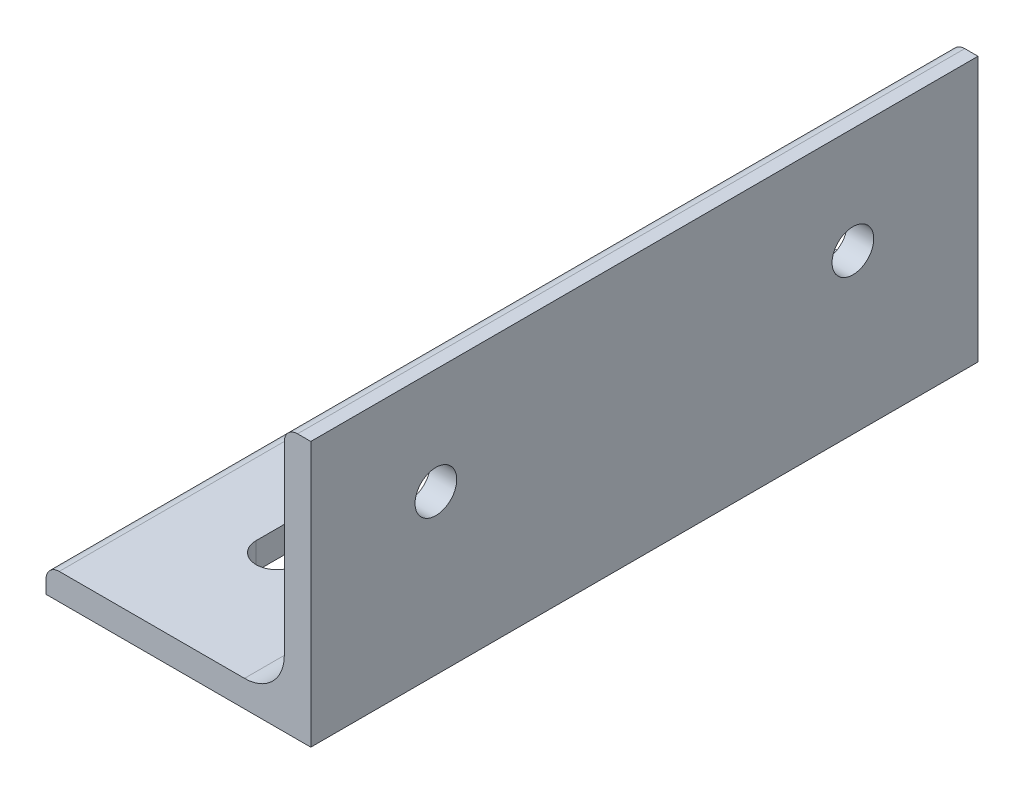
ISO-10303-21;
HEADER;
FILE_DESCRIPTION(('STEP AP214'),'2;1');
FILE_NAME('part.step','',(''),(''),'','','');
FILE_SCHEMA(('AUTOMOTIVE_DESIGN { 1 0 10303 214 1 1 1 1 }'));
ENDSEC;
DATA;
#1=APPLICATION_CONTEXT('core data for automotive mechanical design processes');
#2=APPLICATION_PROTOCOL_DEFINITION('international standard','automotive_design',2000,#1);
#3=PRODUCT_CONTEXT('',#1,'mechanical');
#4=PRODUCT('Part','Part','',(#3));
#5=PRODUCT_RELATED_PRODUCT_CATEGORY('part','',(#4));
#6=PRODUCT_DEFINITION_FORMATION('','',#4);
#7=PRODUCT_DEFINITION_CONTEXT('part definition',#1,'design');
#8=PRODUCT_DEFINITION('design','',#6,#7);
#9=PRODUCT_DEFINITION_SHAPE('','',#8);
#10=(LENGTH_UNIT() NAMED_UNIT(*) SI_UNIT(.MILLI.,.METRE.));
#11=(NAMED_UNIT(*) PLANE_ANGLE_UNIT() SI_UNIT($,.RADIAN.));
#12=(NAMED_UNIT(*) SI_UNIT($,.STERADIAN.) SOLID_ANGLE_UNIT());
#13=UNCERTAINTY_MEASURE_WITH_UNIT(LENGTH_MEASURE(1.E-05),#10,'distance_accuracy_value','');
#14=(GEOMETRIC_REPRESENTATION_CONTEXT(3) GLOBAL_UNCERTAINTY_ASSIGNED_CONTEXT((#13)) GLOBAL_UNIT_ASSIGNED_CONTEXT((#10,
#11,#12)) REPRESENTATION_CONTEXT('',''));
#15=CARTESIAN_POINT('',(0.,0.,0.));
#16=DIRECTION('',(0.,0.,1.));
#17=DIRECTION('',(1.,0.,0.));
#18=AXIS2_PLACEMENT_3D('',#15,#16,#17);
#19=CARTESIAN_POINT('',(-15.875,-14.2875,304.8));
#20=DIRECTION('',(1.,0.,0.));
#21=DIRECTION('',(0.,0.,-1.));
#22=AXIS2_PLACEMENT_3D('',#19,#20,#21);
#23=PLANE('',#22);
#24=DIRECTION('',(0.,1.,0.));
#25=VECTOR('',#24,1.);
#26=CARTESIAN_POINT('',(-15.875,-14.2875,224.8));
#27=LINE('',#26,#25);
#28=CARTESIAN_POINT('',(-15.875,-15.875,224.8));
#29=VERTEX_POINT('',#28);
#30=CARTESIAN_POINT('',(-15.875,-14.2875,224.8));
#31=VERTEX_POINT('',#30);
#32=EDGE_CURVE('E224',#29,#31,#27,.T.);
#33=ORIENTED_EDGE('',*,*,#32,.F.);
#34=DIRECTION('',(0.,0.,-1.));
#35=VECTOR('',#34,1.);
#36=CARTESIAN_POINT('',(-15.875,-15.875,304.8));
#37=LINE('',#36,#35);
#38=CARTESIAN_POINT('',(-15.875,-15.875,304.8));
#39=VERTEX_POINT('',#38);
#40=EDGE_CURVE('E51',#39,#29,#37,.T.);
#41=ORIENTED_EDGE('',*,*,#40,.F.);
#42=DIRECTION('',(0.,-1.,0.));
#43=VECTOR('',#42,1.);
#44=CARTESIAN_POINT('',(-15.875,-14.2875,304.8));
#45=LINE('',#44,#43);
#46=CARTESIAN_POINT('',(-15.875,-14.2875,304.8));
#47=VERTEX_POINT('',#46);
#48=EDGE_CURVE('E227',#47,#39,#45,.T.);
#49=ORIENTED_EDGE('',*,*,#48,.F.);
#50=DIRECTION('',(0.,0.,-1.));
#51=VECTOR('',#50,1.);
#52=CARTESIAN_POINT('',(-15.875,-14.2875,304.8));
#53=LINE('',#52,#51);
#54=EDGE_CURVE('E255',#47,#31,#53,.T.);
#55=ORIENTED_EDGE('',*,*,#54,.T.);
#56=EDGE_LOOP('',(#33,#41,#49,#55));
#57=FACE_BOUND('',#56,.T.);
#58=ADVANCED_FACE('F43',(#57),#23,.F.);
#59=CARTESIAN_POINT('',(-15.875,-15.875,304.8));
#60=DIRECTION('',(0.,1.,0.));
#61=DIRECTION('',(-1.,0.,0.));
#62=AXIS2_PLACEMENT_3D('',#59,#60,#61);
#63=PLANE('',#62);
#64=DIRECTION('',(0.,0.,-1.));
#65=VECTOR('',#64,1.);
#66=CARTESIAN_POINT('',(-0.681349999999997,-15.875,304.8));
#67=LINE('',#66,#65);
#68=CARTESIAN_POINT('',(-0.681349999999996,-15.875,289.8));
#69=VERTEX_POINT('',#68);
#70=CARTESIAN_POINT('',(-0.681349999999991,-15.875,239.8));
#71=VERTEX_POINT('',#70);
#72=EDGE_CURVE('E177',#69,#71,#67,.T.);
#73=ORIENTED_EDGE('',*,*,#72,.T.);
#74=CARTESIAN_POINT('',(-3.18135,-15.875,239.8));
#75=DIRECTION('',(0.,1.,0.));
#76=DIRECTION('',(-1.,0.,0.));
#77=AXIS2_PLACEMENT_3D('',#74,#75,#76);
#78=CIRCLE('',#77,2.5);
#79=CARTESIAN_POINT('',(-5.68135,-15.875,239.8));
#80=VERTEX_POINT('',#79);
#81=EDGE_CURVE('E181',#71,#80,#78,.T.);
#82=ORIENTED_EDGE('',*,*,#81,.T.);
#83=DIRECTION('',(0.,0.,1.));
#84=VECTOR('',#83,1.);
#85=CARTESIAN_POINT('',(-5.68134999999999,-15.875,304.8));
#86=LINE('',#85,#84);
#87=CARTESIAN_POINT('',(-5.68134999999999,-15.875,289.8));
#88=VERTEX_POINT('',#87);
#89=EDGE_CURVE('E168',#80,#88,#86,.T.);
#90=ORIENTED_EDGE('',*,*,#89,.T.);
#91=CARTESIAN_POINT('',(-3.18135,-15.875,289.8));
#92=DIRECTION('',(0.,1.,0.));
#93=DIRECTION('',(-1.,0.,0.));
#94=AXIS2_PLACEMENT_3D('',#91,#92,#93);
#95=CIRCLE('',#94,2.5);
#96=EDGE_CURVE('E143',#88,#69,#95,.T.);
#97=ORIENTED_EDGE('',*,*,#96,.T.);
#98=EDGE_LOOP('',(#73,#82,#90,#97));
#99=FACE_BOUND('',#98,.T.);
#100=DIRECTION('',(1.,0.,0.));
#101=VECTOR('',#100,1.);
#102=CARTESIAN_POINT('',(15.875,-15.875,224.8));
#103=LINE('',#102,#101);
#104=CARTESIAN_POINT('',(15.875,-15.875,224.8));
#105=VERTEX_POINT('',#104);
#106=EDGE_CURVE('E205',#29,#105,#103,.T.);
#107=ORIENTED_EDGE('',*,*,#106,.T.);
#108=DIRECTION('',(0.,0.,-1.));
#109=VECTOR('',#108,1.);
#110=CARTESIAN_POINT('',(15.875,-15.875,304.8));
#111=LINE('',#110,#109);
#112=CARTESIAN_POINT('',(15.875,-15.875,304.8));
#113=VERTEX_POINT('',#112);
#114=EDGE_CURVE('E283',#113,#105,#111,.T.);
#115=ORIENTED_EDGE('',*,*,#114,.F.);
#116=DIRECTION('',(1.,0.,0.));
#117=VECTOR('',#116,1.);
#118=CARTESIAN_POINT('',(-15.875,-15.875,304.8));
#119=LINE('',#118,#117);
#120=EDGE_CURVE('E231',#39,#113,#119,.T.);
#121=ORIENTED_EDGE('',*,*,#120,.F.);
#122=ORIENTED_EDGE('',*,*,#40,.T.);
#123=EDGE_LOOP('',(#107,#115,#121,#122));
#124=FACE_BOUND('',#123,.T.);
#125=ADVANCED_FACE('F290',(#99,#124),#63,.F.);
#126=CARTESIAN_POINT('',(15.875,-15.875,304.8));
#127=DIRECTION('',(-1.,0.,0.));
#128=DIRECTION('',(0.,-1.,0.));
#129=AXIS2_PLACEMENT_3D('',#126,#127,#128);
#130=PLANE('',#129);
#131=CARTESIAN_POINT('',(15.875,3.18135,289.8));
#132=DIRECTION('',(-1.,0.,0.));
#133=DIRECTION('',(0.,-1.,0.));
#134=AXIS2_PLACEMENT_3D('',#131,#132,#133);
#135=CIRCLE('',#134,2.50000000000002);
#136=CARTESIAN_POINT('',(15.875,0.681349999999979,289.8));
#137=VERTEX_POINT('',#136);
#138=EDGE_CURVE('E197',#137,#137,#135,.T.);
#139=ORIENTED_EDGE('',*,*,#138,.T.);
#140=EDGE_LOOP('',(#139));
#141=FACE_BOUND('',#140,.T.);
#142=CARTESIAN_POINT('',(15.875,3.18135,239.8));
#143=DIRECTION('',(-1.,0.,0.));
#144=DIRECTION('',(0.,-1.,0.));
#145=AXIS2_PLACEMENT_3D('',#142,#143,#144);
#146=CIRCLE('',#145,2.5);
#147=CARTESIAN_POINT('',(15.875,0.681350000000005,239.8));
#148=VERTEX_POINT('',#147);
#149=EDGE_CURVE('E190',#148,#148,#146,.T.);
#150=ORIENTED_EDGE('',*,*,#149,.T.);
#151=EDGE_LOOP('',(#150));
#152=FACE_BOUND('',#151,.T.);
#153=DIRECTION('',(0.,1.,0.));
#154=VECTOR('',#153,1.);
#155=CARTESIAN_POINT('',(15.875,-15.875,224.8));
#156=LINE('',#155,#154);
#157=CARTESIAN_POINT('',(15.875,15.875,224.8));
#158=VERTEX_POINT('',#157);
#159=EDGE_CURVE('E201',#105,#158,#156,.T.);
#160=ORIENTED_EDGE('',*,*,#159,.T.);
#161=DIRECTION('',(0.,0.,-1.));
#162=VECTOR('',#161,1.);
#163=CARTESIAN_POINT('',(15.875,15.875,304.8));
#164=LINE('',#163,#162);
#165=CARTESIAN_POINT('',(15.875,15.875,304.8));
#166=VERTEX_POINT('',#165);
#167=EDGE_CURVE('E279',#166,#158,#164,.T.);
#168=ORIENTED_EDGE('',*,*,#167,.F.);
#169=DIRECTION('',(0.,1.,0.));
#170=VECTOR('',#169,1.);
#171=CARTESIAN_POINT('',(15.875,-15.875,304.8));
#172=LINE('',#171,#170);
#173=EDGE_CURVE('E234',#113,#166,#172,.T.);
#174=ORIENTED_EDGE('',*,*,#173,.F.);
#175=ORIENTED_EDGE('',*,*,#114,.T.);
#176=EDGE_LOOP('',(#160,#168,#174,#175));
#177=FACE_BOUND('',#176,.T.);
#178=ADVANCED_FACE('F327',(#141,#152,#177),#130,.F.);
#179=CARTESIAN_POINT('',(14.2875,15.875,304.8));
#180=DIRECTION('',(0.,-1.,0.));
#181=DIRECTION('',(1.,0.,0.));
#182=AXIS2_PLACEMENT_3D('',#179,#180,#181);
#183=PLANE('',#182);
#184=DIRECTION('',(1.,0.,0.));
#185=VECTOR('',#184,1.);
#186=CARTESIAN_POINT('',(14.2875,15.875,224.8));
#187=LINE('',#186,#185);
#188=CARTESIAN_POINT('',(14.2875,15.875,224.8));
#189=VERTEX_POINT('',#188);
#190=EDGE_CURVE('E221',#189,#158,#187,.T.);
#191=ORIENTED_EDGE('',*,*,#190,.F.);
#192=DIRECTION('',(0.,0.,-1.));
#193=VECTOR('',#192,1.);
#194=CARTESIAN_POINT('',(14.2875,15.875,304.8));
#195=LINE('',#194,#193);
#196=CARTESIAN_POINT('',(14.2875,15.875,304.8));
#197=VERTEX_POINT('',#196);
#198=EDGE_CURVE('E275',#197,#189,#195,.T.);
#199=ORIENTED_EDGE('',*,*,#198,.F.);
#200=DIRECTION('',(-1.,0.,0.));
#201=VECTOR('',#200,1.);
#202=CARTESIAN_POINT('',(14.2875,15.875,304.8));
#203=LINE('',#202,#201);
#204=EDGE_CURVE('E237',#166,#197,#203,.T.);
#205=ORIENTED_EDGE('',*,*,#204,.F.);
#206=ORIENTED_EDGE('',*,*,#167,.T.);
#207=EDGE_LOOP('',(#191,#199,#205,#206));
#208=FACE_BOUND('',#207,.T.);
#209=ADVANCED_FACE('F324',(#208),#183,.F.);
#210=CARTESIAN_POINT('',(14.2875,14.2875,304.8));
#211=DIRECTION('',(0.,0.,-1.));
#212=DIRECTION('',(-1.,0.,0.));
#213=AXIS2_PLACEMENT_3D('',#210,#211,#212);
#214=CYLINDRICAL_SURFACE('',#213,1.5875);
#215=CARTESIAN_POINT('',(14.2875,14.2875,224.8));
#216=DIRECTION('',(0.,0.,-1.));
#217=DIRECTION('',(-1.,0.,0.));
#218=AXIS2_PLACEMENT_3D('',#215,#216,#217);
#219=CIRCLE('',#218,1.5875);
#220=CARTESIAN_POINT('',(12.7,14.2875,224.8));
#221=VERTEX_POINT('',#220);
#222=EDGE_CURVE('E218',#221,#189,#219,.T.);
#223=ORIENTED_EDGE('',*,*,#222,.F.);
#224=DIRECTION('',(0.,0.,-1.));
#225=VECTOR('',#224,1.);
#226=CARTESIAN_POINT('',(12.7,14.2875,304.8));
#227=LINE('',#226,#225);
#228=CARTESIAN_POINT('',(12.7,14.2875,304.8));
#229=VERTEX_POINT('',#228);
#230=EDGE_CURVE('E271',#229,#221,#227,.T.);
#231=ORIENTED_EDGE('',*,*,#230,.F.);
#232=CARTESIAN_POINT('',(14.2875,14.2875,304.8));
#233=DIRECTION('',(0.,0.,1.));
#234=DIRECTION('',(-1.,0.,0.));
#235=AXIS2_PLACEMENT_3D('',#232,#233,#234);
#236=CIRCLE('',#235,1.5875);
#237=EDGE_CURVE('E240',#197,#229,#236,.T.);
#238=ORIENTED_EDGE('',*,*,#237,.F.);
#239=ORIENTED_EDGE('',*,*,#198,.T.);
#240=EDGE_LOOP('',(#223,#231,#238,#239));
#241=FACE_BOUND('',#240,.T.);
#242=ADVANCED_FACE('F319',(#241),#214,.T.);
#243=CARTESIAN_POINT('',(12.7,14.2875,304.8));
#244=DIRECTION('',(1.,0.,0.));
#245=DIRECTION('',(0.,1.,0.));
#246=AXIS2_PLACEMENT_3D('',#243,#244,#245);
#247=PLANE('',#246);
#248=CARTESIAN_POINT('',(12.7,3.18135,289.8));
#249=DIRECTION('',(-1.,0.,0.));
#250=DIRECTION('',(0.,-1.,0.));
#251=AXIS2_PLACEMENT_3D('',#248,#249,#250);
#252=CIRCLE('',#251,2.50000000000002);
#253=CARTESIAN_POINT('',(12.7,0.681349999999978,289.8));
#254=VERTEX_POINT('',#253);
#255=EDGE_CURVE('E186',#254,#254,#252,.T.);
#256=ORIENTED_EDGE('',*,*,#255,.F.);
#257=EDGE_LOOP('',(#256));
#258=FACE_BOUND('',#257,.T.);
#259=CARTESIAN_POINT('',(12.7,3.18135,239.8));
#260=DIRECTION('',(-1.,0.,0.));
#261=DIRECTION('',(0.,-1.,0.));
#262=AXIS2_PLACEMENT_3D('',#259,#260,#261);
#263=CIRCLE('',#262,2.5);
#264=CARTESIAN_POINT('',(12.7,0.681350000000005,239.8));
#265=VERTEX_POINT('',#264);
#266=EDGE_CURVE('E185',#265,#265,#263,.T.);
#267=ORIENTED_EDGE('',*,*,#266,.F.);
#268=EDGE_LOOP('',(#267));
#269=FACE_BOUND('',#268,.T.);
#270=DIRECTION('',(0.,1.,0.));
#271=VECTOR('',#270,1.);
#272=CARTESIAN_POINT('',(12.7,14.2875,224.8));
#273=LINE('',#272,#271);
#274=CARTESIAN_POINT('',(12.7,-7.9248,224.8));
#275=VERTEX_POINT('',#274);
#276=EDGE_CURVE('E215',#275,#221,#273,.T.);
#277=ORIENTED_EDGE('',*,*,#276,.F.);
#278=DIRECTION('',(0.,0.,-1.));
#279=VECTOR('',#278,1.);
#280=CARTESIAN_POINT('',(12.7,-7.9248,304.8));
#281=LINE('',#280,#279);
#282=CARTESIAN_POINT('',(12.7,-7.9248,304.8));
#283=VERTEX_POINT('',#282);
#284=EDGE_CURVE('E267',#283,#275,#281,.T.);
#285=ORIENTED_EDGE('',*,*,#284,.F.);
#286=DIRECTION('',(0.,-1.,0.));
#287=VECTOR('',#286,1.);
#288=CARTESIAN_POINT('',(12.7,14.2875,304.8));
#289=LINE('',#288,#287);
#290=EDGE_CURVE('E243',#229,#283,#289,.T.);
#291=ORIENTED_EDGE('',*,*,#290,.F.);
#292=ORIENTED_EDGE('',*,*,#230,.T.);
#293=EDGE_LOOP('',(#277,#285,#291,#292));
#294=FACE_BOUND('',#293,.T.);
#295=ADVANCED_FACE('F314',(#258,#269,#294),#247,.F.);
#296=CARTESIAN_POINT('',(7.92480000000001,-7.9248,304.8));
#297=DIRECTION('',(0.,0.,-1.));
#298=DIRECTION('',(-1.,0.,0.));
#299=AXIS2_PLACEMENT_3D('',#296,#297,#298);
#300=CYLINDRICAL_SURFACE('',#299,4.7752);
#301=CARTESIAN_POINT('',(7.92480000000001,-7.9248,224.8));
#302=DIRECTION('',(0.,0.,-1.));
#303=DIRECTION('',(-1.,0.,0.));
#304=AXIS2_PLACEMENT_3D('',#301,#302,#303);
#305=CIRCLE('',#304,4.7752);
#306=CARTESIAN_POINT('',(7.92480000000001,-12.7,224.8));
#307=VERTEX_POINT('',#306);
#308=EDGE_CURVE('E212',#307,#275,#305,.F.);
#309=ORIENTED_EDGE('',*,*,#308,.F.);
#310=DIRECTION('',(0.,0.,-1.));
#311=VECTOR('',#310,1.);
#312=CARTESIAN_POINT('',(7.92480000000001,-12.7,304.8));
#313=LINE('',#312,#311);
#314=CARTESIAN_POINT('',(7.92480000000001,-12.7,304.8));
#315=VERTEX_POINT('',#314);
#316=EDGE_CURVE('E263',#315,#307,#313,.T.);
#317=ORIENTED_EDGE('',*,*,#316,.F.);
#318=CARTESIAN_POINT('',(7.92480000000001,-7.9248,304.8));
#319=DIRECTION('',(0.,0.,-1.));
#320=DIRECTION('',(-1.,0.,0.));
#321=AXIS2_PLACEMENT_3D('',#318,#319,#320);
#322=CIRCLE('',#321,4.7752);
#323=EDGE_CURVE('E246',#283,#315,#322,.T.);
#324=ORIENTED_EDGE('',*,*,#323,.F.);
#325=ORIENTED_EDGE('',*,*,#284,.T.);
#326=EDGE_LOOP('',(#309,#317,#324,#325));
#327=FACE_BOUND('',#326,.T.);
#328=ADVANCED_FACE('F309',(#327),#300,.F.);
#329=CARTESIAN_POINT('',(7.92480000000001,-12.7,304.8));
#330=DIRECTION('',(0.,-1.,0.));
#331=DIRECTION('',(1.,0.,0.));
#332=AXIS2_PLACEMENT_3D('',#329,#330,#331);
#333=PLANE('',#332);
#334=DIRECTION('',(0.,0.,1.));
#335=VECTOR('',#334,1.);
#336=CARTESIAN_POINT('',(-5.68135,-12.7,239.8));
#337=LINE('',#336,#335);
#338=CARTESIAN_POINT('',(-5.68135,-12.7,239.8));
#339=VERTEX_POINT('',#338);
#340=CARTESIAN_POINT('',(-5.68134999999999,-12.7,289.8));
#341=VERTEX_POINT('',#340);
#342=EDGE_CURVE('E150',#339,#341,#337,.T.);
#343=ORIENTED_EDGE('',*,*,#342,.F.);
#344=CARTESIAN_POINT('',(-3.18135,-12.7,239.8));
#345=DIRECTION('',(0.,1.,0.));
#346=DIRECTION('',(-1.,0.,0.));
#347=AXIS2_PLACEMENT_3D('',#344,#345,#346);
#348=CIRCLE('',#347,2.5);
#349=CARTESIAN_POINT('',(-0.681349999999991,-12.7,239.8));
#350=VERTEX_POINT('',#349);
#351=EDGE_CURVE('E66',#350,#339,#348,.T.);
#352=ORIENTED_EDGE('',*,*,#351,.F.);
#353=DIRECTION('',(0.,0.,-1.));
#354=VECTOR('',#353,1.);
#355=CARTESIAN_POINT('',(-0.681349999999991,-12.7,239.8));
#356=LINE('',#355,#354);
#357=CARTESIAN_POINT('',(-0.681349999999996,-12.7,289.8));
#358=VERTEX_POINT('',#357);
#359=EDGE_CURVE('E158',#358,#350,#356,.T.);
#360=ORIENTED_EDGE('',*,*,#359,.F.);
#361=CARTESIAN_POINT('',(-3.18135,-12.7,289.8));
#362=DIRECTION('',(0.,1.,0.));
#363=DIRECTION('',(-1.,0.,0.));
#364=AXIS2_PLACEMENT_3D('',#361,#362,#363);
#365=CIRCLE('',#364,2.5);
#366=EDGE_CURVE('E140',#341,#358,#365,.T.);
#367=ORIENTED_EDGE('',*,*,#366,.F.);
#368=EDGE_LOOP('',(#343,#352,#360,#367));
#369=FACE_BOUND('',#368,.T.);
#370=DIRECTION('',(1.,0.,0.));
#371=VECTOR('',#370,1.);
#372=CARTESIAN_POINT('',(7.92480000000001,-12.7,224.8));
#373=LINE('',#372,#371);
#374=CARTESIAN_POINT('',(-14.2875,-12.7,224.8));
#375=VERTEX_POINT('',#374);
#376=EDGE_CURVE('E209',#375,#307,#373,.T.);
#377=ORIENTED_EDGE('',*,*,#376,.F.);
#378=DIRECTION('',(0.,0.,-1.));
#379=VECTOR('',#378,1.);
#380=CARTESIAN_POINT('',(-14.2875,-12.7,304.8));
#381=LINE('',#380,#379);
#382=CARTESIAN_POINT('',(-14.2875,-12.7,304.8));
#383=VERTEX_POINT('',#382);
#384=EDGE_CURVE('E259',#383,#375,#381,.T.);
#385=ORIENTED_EDGE('',*,*,#384,.F.);
#386=DIRECTION('',(-1.,0.,0.));
#387=VECTOR('',#386,1.);
#388=CARTESIAN_POINT('',(7.92480000000001,-12.7,304.8));
#389=LINE('',#388,#387);
#390=EDGE_CURVE('E249',#315,#383,#389,.T.);
#391=ORIENTED_EDGE('',*,*,#390,.F.);
#392=ORIENTED_EDGE('',*,*,#316,.T.);
#393=EDGE_LOOP('',(#377,#385,#391,#392));
#394=FACE_BOUND('',#393,.T.);
#395=ADVANCED_FACE('F155',(#369,#394),#333,.F.);
#396=CARTESIAN_POINT('',(-14.2875,-14.2875,304.8));
#397=DIRECTION('',(0.,0.,-1.));
#398=DIRECTION('',(-1.,0.,0.));
#399=AXIS2_PLACEMENT_3D('',#396,#397,#398);
#400=CYLINDRICAL_SURFACE('',#399,1.5875);
#401=CARTESIAN_POINT('',(-14.2875,-14.2875,224.8));
#402=DIRECTION('',(0.,0.,-1.));
#403=DIRECTION('',(-1.,0.,0.));
#404=AXIS2_PLACEMENT_3D('',#401,#402,#403);
#405=CIRCLE('',#404,1.5875);
#406=EDGE_CURVE('E12',#31,#375,#405,.T.);
#407=ORIENTED_EDGE('',*,*,#406,.F.);
#408=ORIENTED_EDGE('',*,*,#54,.F.);
#409=CARTESIAN_POINT('',(-14.2875,-14.2875,304.8));
#410=DIRECTION('',(0.,0.,1.));
#411=DIRECTION('',(-1.,0.,0.));
#412=AXIS2_PLACEMENT_3D('',#409,#410,#411);
#413=CIRCLE('',#412,1.5875);
#414=EDGE_CURVE('E252',#383,#47,#413,.T.);
#415=ORIENTED_EDGE('',*,*,#414,.F.);
#416=ORIENTED_EDGE('',*,*,#384,.T.);
#417=EDGE_LOOP('',(#407,#408,#415,#416));
#418=FACE_BOUND('',#417,.T.);
#419=ADVANCED_FACE('F301',(#418),#400,.T.);
#420=CARTESIAN_POINT('',(14.2875,14.2875,304.8));
#421=DIRECTION('',(0.,0.,-1.));
#422=DIRECTION('',(-1.,0.,0.));
#423=AXIS2_PLACEMENT_3D('',#420,#421,#422);
#424=PLANE('',#423);
#425=ORIENTED_EDGE('',*,*,#48,.T.);
#426=ORIENTED_EDGE('',*,*,#120,.T.);
#427=ORIENTED_EDGE('',*,*,#173,.T.);
#428=ORIENTED_EDGE('',*,*,#204,.T.);
#429=ORIENTED_EDGE('',*,*,#237,.T.);
#430=ORIENTED_EDGE('',*,*,#290,.T.);
#431=ORIENTED_EDGE('',*,*,#323,.T.);
#432=ORIENTED_EDGE('',*,*,#390,.T.);
#433=ORIENTED_EDGE('',*,*,#414,.T.);
#434=EDGE_LOOP('',(#425,#426,#427,#428,#429,#430,#431,#432,#433));
#435=FACE_BOUND('',#434,.T.);
#436=ADVANCED_FACE('F330',(#435),#424,.F.);
#437=CARTESIAN_POINT('',(14.2875,14.2875,224.8));
#438=DIRECTION('',(0.,0.,-1.));
#439=DIRECTION('',(-1.,0.,0.));
#440=AXIS2_PLACEMENT_3D('',#437,#438,#439);
#441=PLANE('',#440);
#442=ORIENTED_EDGE('',*,*,#32,.T.);
#443=ORIENTED_EDGE('',*,*,#406,.T.);
#444=ORIENTED_EDGE('',*,*,#376,.T.);
#445=ORIENTED_EDGE('',*,*,#308,.T.);
#446=ORIENTED_EDGE('',*,*,#276,.T.);
#447=ORIENTED_EDGE('',*,*,#222,.T.);
#448=ORIENTED_EDGE('',*,*,#190,.T.);
#449=ORIENTED_EDGE('',*,*,#159,.F.);
#450=ORIENTED_EDGE('',*,*,#106,.F.);
#451=EDGE_LOOP('',(#442,#443,#444,#445,#446,#447,#448,#449,#450));
#452=FACE_BOUND('',#451,.T.);
#453=ADVANCED_FACE('F298',(#452),#441,.T.);
#454=CARTESIAN_POINT('',(114.3,3.18135000000002,239.8));
#455=DIRECTION('',(-1.,0.,0.));
#456=DIRECTION('',(0.,-1.,0.));
#457=AXIS2_PLACEMENT_3D('',#454,#455,#456);
#458=CYLINDRICAL_SURFACE('',#457,2.5);
#459=ORIENTED_EDGE('',*,*,#266,.T.);
#460=EDGE_LOOP('',(#459));
#461=FACE_BOUND('',#460,.T.);
#462=ORIENTED_EDGE('',*,*,#149,.F.);
#463=EDGE_LOOP('',(#462));
#464=FACE_BOUND('',#463,.T.);
#465=ADVANCED_FACE('F337',(#461,#464),#458,.F.);
#466=CARTESIAN_POINT('',(114.3,3.18135000000002,289.8));
#467=DIRECTION('',(-1.,0.,0.));
#468=DIRECTION('',(0.,-1.,0.));
#469=AXIS2_PLACEMENT_3D('',#466,#467,#468);
#470=CYLINDRICAL_SURFACE('',#469,2.50000000000002);
#471=ORIENTED_EDGE('',*,*,#255,.T.);
#472=EDGE_LOOP('',(#471));
#473=FACE_BOUND('',#472,.T.);
#474=ORIENTED_EDGE('',*,*,#138,.F.);
#475=EDGE_LOOP('',(#474));
#476=FACE_BOUND('',#475,.T.);
#477=ADVANCED_FACE('F378',(#473,#476),#470,.F.);
#478=CARTESIAN_POINT('',(-3.18134999999999,-114.3,239.8));
#479=DIRECTION('',(0.,1.,0.));
#480=DIRECTION('',(-1.,0.,0.));
#481=AXIS2_PLACEMENT_3D('',#478,#479,#480);
#482=CYLINDRICAL_SURFACE('',#481,2.5);
#483=DIRECTION('',(0.,1.,0.));
#484=VECTOR('',#483,1.);
#485=CARTESIAN_POINT('',(-0.681349999999983,-114.3,239.8));
#486=LINE('',#485,#484);
#487=EDGE_CURVE('E165',#71,#350,#486,.T.);
#488=ORIENTED_EDGE('',*,*,#487,.T.);
#489=ORIENTED_EDGE('',*,*,#351,.T.);
#490=DIRECTION('',(0.,1.,0.));
#491=VECTOR('',#490,1.);
#492=CARTESIAN_POINT('',(-5.68134999999999,-114.3,239.8));
#493=LINE('',#492,#491);
#494=EDGE_CURVE('E147',#80,#339,#493,.T.);
#495=ORIENTED_EDGE('',*,*,#494,.F.);
#496=ORIENTED_EDGE('',*,*,#81,.F.);
#497=EDGE_LOOP('',(#488,#489,#495,#496));
#498=FACE_BOUND('',#497,.T.);
#499=ADVANCED_FACE('F372',(#498),#482,.F.);
#500=CARTESIAN_POINT('',(-0.681349999999983,-114.3,239.8));
#501=DIRECTION('',(1.,0.,0.));
#502=DIRECTION('',(0.,0.,-1.));
#503=AXIS2_PLACEMENT_3D('',#500,#501,#502);
#504=PLANE('',#503);
#505=DIRECTION('',(0.,1.,0.));
#506=VECTOR('',#505,1.);
#507=CARTESIAN_POINT('',(-0.681349999999988,-114.3,289.8));
#508=LINE('',#507,#506);
#509=EDGE_CURVE('E146',#69,#358,#508,.T.);
#510=ORIENTED_EDGE('',*,*,#509,.T.);
#511=ORIENTED_EDGE('',*,*,#359,.T.);
#512=ORIENTED_EDGE('',*,*,#487,.F.);
#513=ORIENTED_EDGE('',*,*,#72,.F.);
#514=EDGE_LOOP('',(#510,#511,#512,#513));
#515=FACE_BOUND('',#514,.T.);
#516=ADVANCED_FACE('F377',(#515),#504,.F.);
#517=CARTESIAN_POINT('',(-3.18134999999999,-114.3,289.8));
#518=DIRECTION('',(0.,1.,0.));
#519=DIRECTION('',(-1.,0.,0.));
#520=AXIS2_PLACEMENT_3D('',#517,#518,#519);
#521=CYLINDRICAL_SURFACE('',#520,2.5);
#522=DIRECTION('',(0.,1.,0.));
#523=VECTOR('',#522,1.);
#524=CARTESIAN_POINT('',(-5.68134999999999,-114.3,289.8));
#525=LINE('',#524,#523);
#526=EDGE_CURVE('E58',#88,#341,#525,.T.);
#527=ORIENTED_EDGE('',*,*,#526,.T.);
#528=ORIENTED_EDGE('',*,*,#366,.T.);
#529=ORIENTED_EDGE('',*,*,#509,.F.);
#530=ORIENTED_EDGE('',*,*,#96,.F.);
#531=EDGE_LOOP('',(#527,#528,#529,#530));
#532=FACE_BOUND('',#531,.T.);
#533=ADVANCED_FACE('F137',(#532),#521,.F.);
#534=CARTESIAN_POINT('',(-5.68134999999999,-114.3,239.8));
#535=DIRECTION('',(-1.,0.,0.));
#536=DIRECTION('',(0.,0.,1.));
#537=AXIS2_PLACEMENT_3D('',#534,#535,#536);
#538=PLANE('',#537);
#539=ORIENTED_EDGE('',*,*,#494,.T.);
#540=ORIENTED_EDGE('',*,*,#342,.T.);
#541=ORIENTED_EDGE('',*,*,#526,.F.);
#542=ORIENTED_EDGE('',*,*,#89,.F.);
#543=EDGE_LOOP('',(#539,#540,#541,#542));
#544=FACE_BOUND('',#543,.T.);
#545=ADVANCED_FACE('F151',(#544),#538,.F.);
#546=CLOSED_SHELL('',(#58,#125,#178,#209,#242,#295,#328,#395,#419,#436,#453,#465,#477,#499,#516,
#533,#545));
#547=MANIFOLD_SOLID_BREP('B2',#546);
#548=ADVANCED_BREP_SHAPE_REPRESENTATION('',(#18,#547),#14);
#549=SHAPE_DEFINITION_REPRESENTATION(#9,#548);
ENDSEC;
END-ISO-10303-21;
